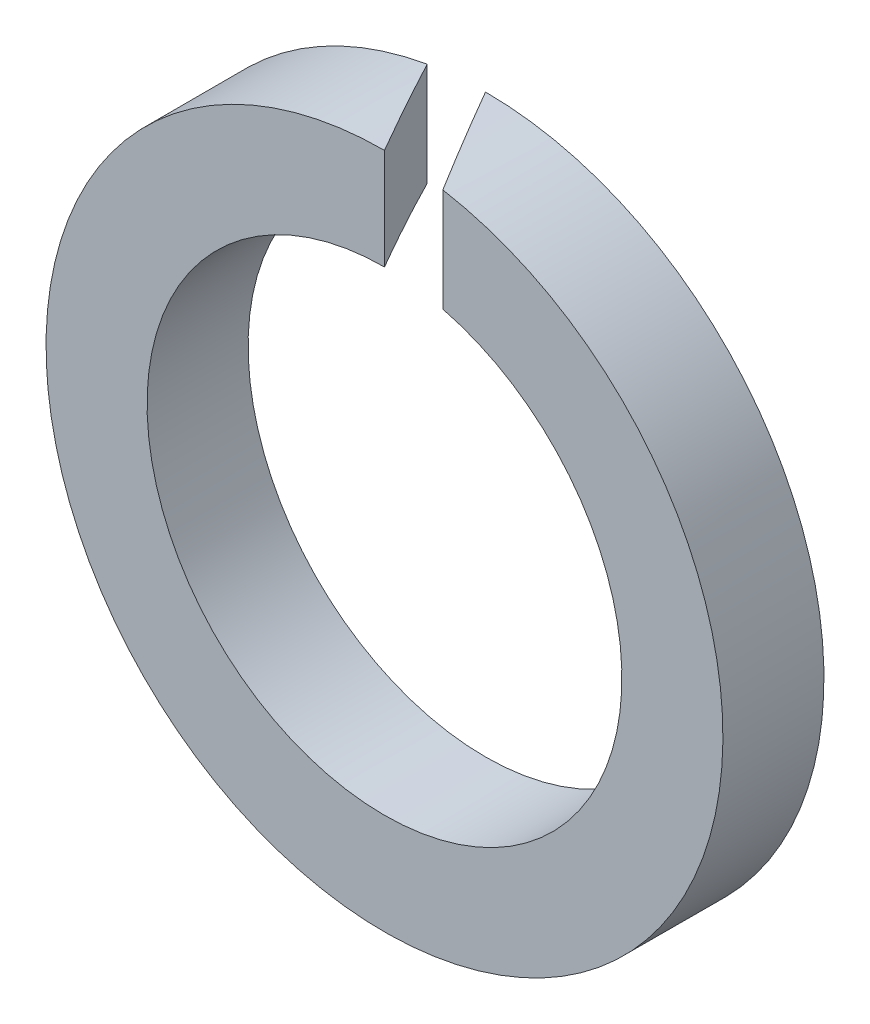
ISO-10303-21;
HEADER;
FILE_DESCRIPTION(('STEP AP214'),'2;1');
FILE_NAME('part.step','',(''),(''),'','','');
FILE_SCHEMA(('AUTOMOTIVE_DESIGN { 1 0 10303 214 1 1 1 1 }'));
ENDSEC;
DATA;
#1=APPLICATION_CONTEXT('core data for automotive mechanical design processes');
#2=APPLICATION_PROTOCOL_DEFINITION('international standard','automotive_design',2000,#1);
#3=PRODUCT_CONTEXT('',#1,'mechanical');
#4=PRODUCT('Part','Part','',(#3));
#5=PRODUCT_RELATED_PRODUCT_CATEGORY('part','',(#4));
#6=PRODUCT_DEFINITION_FORMATION('','',#4);
#7=PRODUCT_DEFINITION_CONTEXT('part definition',#1,'design');
#8=PRODUCT_DEFINITION('design','',#6,#7);
#9=PRODUCT_DEFINITION_SHAPE('','',#8);
#10=(LENGTH_UNIT() NAMED_UNIT(*) SI_UNIT(.MILLI.,.METRE.));
#11=(NAMED_UNIT(*) PLANE_ANGLE_UNIT() SI_UNIT($,.RADIAN.));
#12=(NAMED_UNIT(*) SI_UNIT($,.STERADIAN.) SOLID_ANGLE_UNIT());
#13=UNCERTAINTY_MEASURE_WITH_UNIT(LENGTH_MEASURE(1.E-05),#10,'distance_accuracy_value','');
#14=(GEOMETRIC_REPRESENTATION_CONTEXT(3) GLOBAL_UNCERTAINTY_ASSIGNED_CONTEXT((#13)) GLOBAL_UNIT_ASSIGNED_CONTEXT((#10,
#11,#12)) REPRESENTATION_CONTEXT('',''));
#15=CARTESIAN_POINT('',(0.,0.,0.));
#16=DIRECTION('',(0.,0.,1.));
#17=DIRECTION('',(1.,0.,0.));
#18=AXIS2_PLACEMENT_3D('',#15,#16,#17);
#19=CARTESIAN_POINT('',(0.,0.,-0.5));
#20=DIRECTION('',(0.,0.,1.));
#21=DIRECTION('',(1.,0.,0.));
#22=AXIS2_PLACEMENT_3D('',#19,#20,#21);
#23=PLANE('',#22);
#24=DIRECTION('',(0.,1.,0.));
#25=VECTOR('',#24,1.);
#26=CARTESIAN_POINT('',(-0.288675134594813,1.675,-0.5));
#27=LINE('',#26,#25);
#28=CARTESIAN_POINT('',(-0.288675134594813,1.1389871231347,-0.5));
#29=VERTEX_POINT('',#28);
#30=CARTESIAN_POINT('',(-0.288675134594813,1.64993686747908,-0.5));
#31=VERTEX_POINT('',#30);
#32=EDGE_CURVE('E58',#29,#31,#27,.T.);
#33=ORIENTED_EDGE('',*,*,#32,.F.);
#34=CARTESIAN_POINT('',(0.,0.,-0.5));
#35=DIRECTION('',(0.,0.,1.));
#36=DIRECTION('',(1.,0.,0.));
#37=AXIS2_PLACEMENT_3D('',#34,#35,#36);
#38=CIRCLE('',#37,1.175);
#39=CARTESIAN_POINT('',(0.,1.175,-0.5));
#40=VERTEX_POINT('',#39);
#41=EDGE_CURVE('E52',#29,#40,#38,.T.);
#42=ORIENTED_EDGE('',*,*,#41,.T.);
#43=DIRECTION('',(0.,1.,0.));
#44=VECTOR('',#43,1.);
#45=CARTESIAN_POINT('',(0.,1.675,-0.5));
#46=LINE('',#45,#44);
#47=CARTESIAN_POINT('',(0.,1.675,-0.5));
#48=VERTEX_POINT('',#47);
#49=EDGE_CURVE('E55',#48,#40,#46,.F.);
#50=ORIENTED_EDGE('',*,*,#49,.F.);
#51=CARTESIAN_POINT('',(0.,0.,-0.5));
#52=DIRECTION('',(0.,0.,1.));
#53=DIRECTION('',(1.,0.,0.));
#54=AXIS2_PLACEMENT_3D('',#51,#52,#53);
#55=CIRCLE('',#54,1.675);
#56=EDGE_CURVE('E73',#31,#48,#55,.T.);
#57=ORIENTED_EDGE('',*,*,#56,.F.);
#58=EDGE_LOOP('',(#33,#42,#50,#57));
#59=FACE_BOUND('',#58,.T.);
#60=ADVANCED_FACE('F16',(#59),#23,.F.);
#61=CARTESIAN_POINT('',(0.,1.675,0.));
#62=DIRECTION('',(0.866025403784439,0.,-0.5));
#63=DIRECTION('',(-0.5,0.,-0.866025403784439));
#64=AXIS2_PLACEMENT_3D('',#61,#62,#63);
#65=PLANE('',#64);
#66=ORIENTED_EDGE('',*,*,#32,.T.);
#67=CARTESIAN_POINT('',(0.,0.,0.));
#68=DIRECTION('',(0.866025403784439,0.,-0.5));
#69=DIRECTION('',(0.5,0.,0.866025403784439));
#70=AXIS2_PLACEMENT_3D('',#67,#68,#69);
#71=ELLIPSE('',#70,3.35,1.675);
#72=CARTESIAN_POINT('',(0.,1.675,0.));
#73=VERTEX_POINT('',#72);
#74=EDGE_CURVE('E76',#73,#31,#71,.F.);
#75=ORIENTED_EDGE('',*,*,#74,.F.);
#76=DIRECTION('',(0.,1.,0.));
#77=VECTOR('',#76,1.);
#78=CARTESIAN_POINT('',(0.,0.,0.));
#79=LINE('',#78,#77);
#80=CARTESIAN_POINT('',(0.,1.175,0.));
#81=VERTEX_POINT('',#80);
#82=EDGE_CURVE('E80',#81,#73,#79,.T.);
#83=ORIENTED_EDGE('',*,*,#82,.F.);
#84=CARTESIAN_POINT('',(0.,0.,0.));
#85=DIRECTION('',(0.866025403784439,0.,-0.5));
#86=DIRECTION('',(0.5,0.,0.866025403784439));
#87=AXIS2_PLACEMENT_3D('',#84,#85,#86);
#88=ELLIPSE('',#87,2.35,1.175);
#89=EDGE_CURVE('E70',#81,#29,#88,.F.);
#90=ORIENTED_EDGE('',*,*,#89,.T.);
#91=EDGE_LOOP('',(#66,#75,#83,#90));
#92=FACE_BOUND('',#91,.T.);
#93=ADVANCED_FACE('F87',(#92),#65,.T.);
#94=CARTESIAN_POINT('',(0.,0.,-0.5));
#95=DIRECTION('',(0.,0.,1.));
#96=DIRECTION('',(1.,0.,0.));
#97=AXIS2_PLACEMENT_3D('',#94,#95,#96);
#98=CYLINDRICAL_SURFACE('',#97,1.675);
#99=CARTESIAN_POINT('',(0.,0.,-0.5));
#100=DIRECTION('',(-0.866025403784439,0.,0.5));
#101=DIRECTION('',(0.5,0.,0.866025403784439));
#102=AXIS2_PLACEMENT_3D('',#99,#100,#101);
#103=ELLIPSE('',#102,3.35,1.675);
#104=CARTESIAN_POINT('',(0.288675134594813,1.64993686747908,0.));
#105=VERTEX_POINT('',#104);
#106=EDGE_CURVE('E62',#105,#48,#103,.T.);
#107=ORIENTED_EDGE('',*,*,#106,.F.);
#108=CARTESIAN_POINT('',(0.,0.,0.));
#109=DIRECTION('',(0.,0.,1.));
#110=DIRECTION('',(1.,0.,0.));
#111=AXIS2_PLACEMENT_3D('',#108,#109,#110);
#112=CIRCLE('',#111,1.675);
#113=EDGE_CURVE('E25',#73,#105,#112,.T.);
#114=ORIENTED_EDGE('',*,*,#113,.F.);
#115=ORIENTED_EDGE('',*,*,#74,.T.);
#116=ORIENTED_EDGE('',*,*,#56,.T.);
#117=EDGE_LOOP('',(#107,#114,#115,#116));
#118=FACE_BOUND('',#117,.T.);
#119=ADVANCED_FACE('F99',(#118),#98,.T.);
#120=CARTESIAN_POINT('',(0.,1.675,-0.5));
#121=DIRECTION('',(-0.866025403784439,0.,0.5));
#122=DIRECTION('',(0.5,0.,0.866025403784439));
#123=AXIS2_PLACEMENT_3D('',#120,#121,#122);
#124=PLANE('',#123);
#125=DIRECTION('',(0.,1.,0.));
#126=VECTOR('',#125,1.);
#127=CARTESIAN_POINT('',(0.288675134594813,0.,0.));
#128=LINE('',#127,#126);
#129=CARTESIAN_POINT('',(0.288675134594813,1.1389871231347,0.));
#130=VERTEX_POINT('',#129);
#131=EDGE_CURVE('E11',#105,#130,#128,.F.);
#132=ORIENTED_EDGE('',*,*,#131,.F.);
#133=ORIENTED_EDGE('',*,*,#106,.T.);
#134=ORIENTED_EDGE('',*,*,#49,.T.);
#135=CARTESIAN_POINT('',(0.,0.,-0.5));
#136=DIRECTION('',(-0.866025403784439,0.,0.5));
#137=DIRECTION('',(0.5,0.,0.866025403784439));
#138=AXIS2_PLACEMENT_3D('',#135,#136,#137);
#139=ELLIPSE('',#138,2.35,1.175);
#140=EDGE_CURVE('E19',#40,#130,#139,.F.);
#141=ORIENTED_EDGE('',*,*,#140,.T.);
#142=EDGE_LOOP('',(#132,#133,#134,#141));
#143=FACE_BOUND('',#142,.T.);
#144=ADVANCED_FACE('F72',(#143),#124,.T.);
#145=CARTESIAN_POINT('',(0.,0.,-0.5));
#146=DIRECTION('',(0.,0.,1.));
#147=DIRECTION('',(1.,0.,0.));
#148=AXIS2_PLACEMENT_3D('',#145,#146,#147);
#149=CYLINDRICAL_SURFACE('',#148,1.175);
#150=ORIENTED_EDGE('',*,*,#41,.F.);
#151=ORIENTED_EDGE('',*,*,#89,.F.);
#152=CARTESIAN_POINT('',(0.,0.,0.));
#153=DIRECTION('',(0.,0.,1.));
#154=DIRECTION('',(1.,0.,0.));
#155=AXIS2_PLACEMENT_3D('',#152,#153,#154);
#156=CIRCLE('',#155,1.175);
#157=EDGE_CURVE('E61',#130,#81,#156,.F.);
#158=ORIENTED_EDGE('',*,*,#157,.F.);
#159=ORIENTED_EDGE('',*,*,#140,.F.);
#160=EDGE_LOOP('',(#150,#151,#158,#159));
#161=FACE_BOUND('',#160,.T.);
#162=ADVANCED_FACE('F66',(#161),#149,.F.);
#163=CARTESIAN_POINT('',(0.,0.,0.));
#164=DIRECTION('',(0.,0.,1.));
#165=DIRECTION('',(1.,0.,0.));
#166=AXIS2_PLACEMENT_3D('',#163,#164,#165);
#167=PLANE('',#166);
#168=ORIENTED_EDGE('',*,*,#131,.T.);
#169=ORIENTED_EDGE('',*,*,#157,.T.);
#170=ORIENTED_EDGE('',*,*,#82,.T.);
#171=ORIENTED_EDGE('',*,*,#113,.T.);
#172=EDGE_LOOP('',(#168,#169,#170,#171));
#173=FACE_BOUND('',#172,.T.);
#174=ADVANCED_FACE('F88',(#173),#167,.T.);
#175=CLOSED_SHELL('',(#60,#93,#119,#144,#162,#174));
#176=MANIFOLD_SOLID_BREP('B1',#175);
#177=ADVANCED_BREP_SHAPE_REPRESENTATION('',(#18,#176),#14);
#178=SHAPE_DEFINITION_REPRESENTATION(#9,#177);
ENDSEC;
END-ISO-10303-21;
